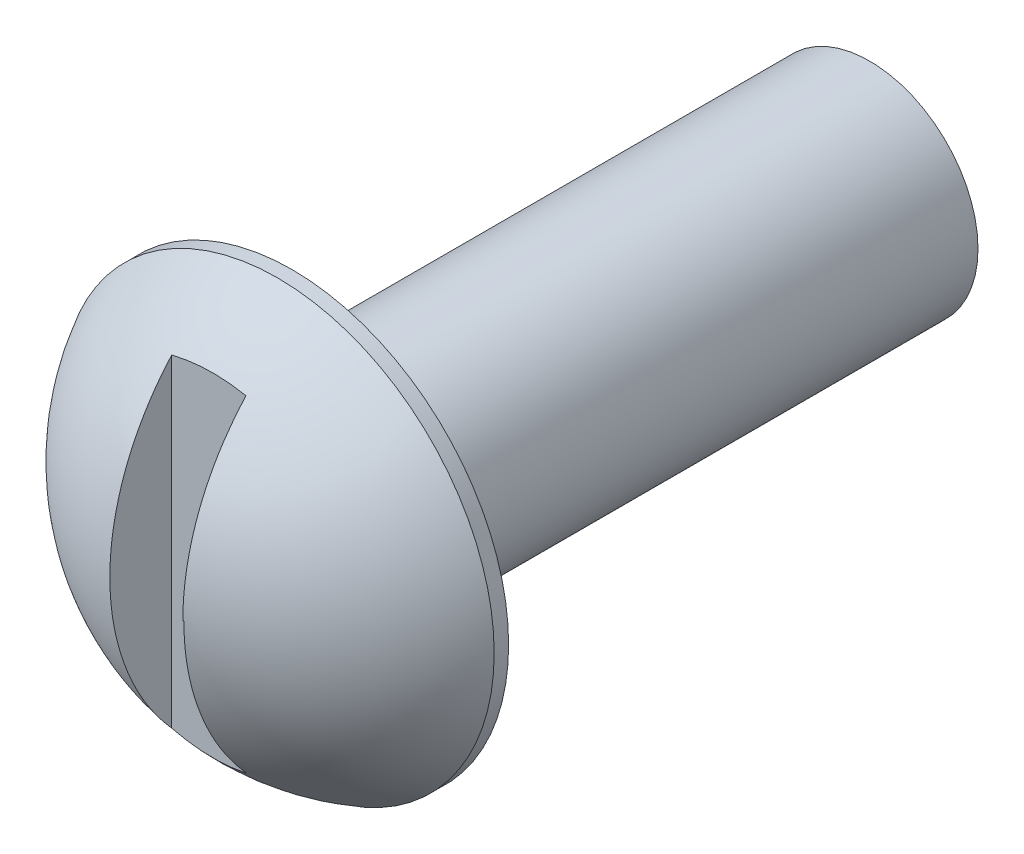
ISO-10303-21;
HEADER;
FILE_DESCRIPTION(('STEP AP214'),'2;1');
FILE_NAME('part.step','',(''),(''),'','','');
FILE_SCHEMA(('AUTOMOTIVE_DESIGN { 1 0 10303 214 1 1 1 1 }'));
ENDSEC;
DATA;
#1=APPLICATION_CONTEXT('core data for automotive mechanical design processes');
#2=APPLICATION_PROTOCOL_DEFINITION('international standard','automotive_design',2000,#1);
#3=PRODUCT_CONTEXT('',#1,'mechanical');
#4=PRODUCT('Part','Part','',(#3));
#5=PRODUCT_RELATED_PRODUCT_CATEGORY('part','',(#4));
#6=PRODUCT_DEFINITION_FORMATION('','',#4);
#7=PRODUCT_DEFINITION_CONTEXT('part definition',#1,'design');
#8=PRODUCT_DEFINITION('design','',#6,#7);
#9=PRODUCT_DEFINITION_SHAPE('','',#8);
#10=(LENGTH_UNIT() NAMED_UNIT(*) SI_UNIT(.MILLI.,.METRE.));
#11=(NAMED_UNIT(*) PLANE_ANGLE_UNIT() SI_UNIT($,.RADIAN.));
#12=(NAMED_UNIT(*) SI_UNIT($,.STERADIAN.) SOLID_ANGLE_UNIT());
#13=UNCERTAINTY_MEASURE_WITH_UNIT(LENGTH_MEASURE(1.E-05),#10,'distance_accuracy_value','');
#14=(GEOMETRIC_REPRESENTATION_CONTEXT(3) GLOBAL_UNCERTAINTY_ASSIGNED_CONTEXT((#13)) GLOBAL_UNIT_ASSIGNED_CONTEXT((#10,
#11,#12)) REPRESENTATION_CONTEXT('',''));
#15=CARTESIAN_POINT('',(0.,0.,0.));
#16=DIRECTION('',(0.,0.,1.));
#17=DIRECTION('',(1.,0.,0.));
#18=AXIS2_PLACEMENT_3D('',#15,#16,#17);
#19=CARTESIAN_POINT('',(0.,0.,8.));
#20=DIRECTION('',(0.,0.,-1.));
#21=DIRECTION('',(-1.,0.,0.));
#22=AXIS2_PLACEMENT_3D('',#19,#20,#21);
#23=CYLINDRICAL_SURFACE('',#22,1.5);
#24=CARTESIAN_POINT('',(0.,0.,8.));
#25=DIRECTION('',(0.,0.,1.));
#26=DIRECTION('',(1.,0.,0.));
#27=AXIS2_PLACEMENT_3D('',#24,#25,#26);
#28=CIRCLE('',#27,1.5);
#29=CARTESIAN_POINT('',(1.5,0.,8.));
#30=VERTEX_POINT('',#29);
#31=EDGE_CURVE('E102',#30,#30,#28,.T.);
#32=ORIENTED_EDGE('',*,*,#31,.F.);
#33=EDGE_LOOP('',(#32));
#34=FACE_BOUND('',#33,.T.);
#35=CARTESIAN_POINT('',(0.,0.,0.));
#36=DIRECTION('',(0.,0.,1.));
#37=DIRECTION('',(1.,0.,0.));
#38=AXIS2_PLACEMENT_3D('',#35,#36,#37);
#39=CIRCLE('',#38,1.5);
#40=CARTESIAN_POINT('',(1.5,0.,0.));
#41=VERTEX_POINT('',#40);
#42=EDGE_CURVE('E105',#41,#41,#39,.T.);
#43=ORIENTED_EDGE('',*,*,#42,.T.);
#44=EDGE_LOOP('',(#43));
#45=FACE_BOUND('',#44,.T.);
#46=ADVANCED_FACE('F31',(#34,#45),#23,.T.);
#47=CARTESIAN_POINT('',(0.,0.,0.));
#48=DIRECTION('',(0.,0.,1.));
#49=DIRECTION('',(1.,0.,0.));
#50=AXIS2_PLACEMENT_3D('',#47,#48,#49);
#51=PLANE('',#50);
#52=ORIENTED_EDGE('',*,*,#42,.F.);
#53=EDGE_LOOP('',(#52));
#54=FACE_BOUND('',#53,.T.);
#55=ADVANCED_FACE('F130',(#54),#51,.F.);
#56=CARTESIAN_POINT('',(0.,0.,8.));
#57=DIRECTION('',(0.,0.,1.));
#58=DIRECTION('',(1.,0.,0.));
#59=AXIS2_PLACEMENT_3D('',#56,#57,#58);
#60=PLANE('',#59);
#61=CARTESIAN_POINT('',(0.,0.,8.));
#62=DIRECTION('',(0.,0.,1.));
#63=DIRECTION('',(1.,0.,0.));
#64=AXIS2_PLACEMENT_3D('',#61,#62,#63);
#65=CIRCLE('',#64,3.);
#66=CARTESIAN_POINT('',(3.,0.,8.));
#67=VERTEX_POINT('',#66);
#68=EDGE_CURVE('E97',#67,#67,#65,.T.);
#69=ORIENTED_EDGE('',*,*,#68,.F.);
#70=EDGE_LOOP('',(#69));
#71=FACE_BOUND('',#70,.T.);
#72=ORIENTED_EDGE('',*,*,#31,.T.);
#73=EDGE_LOOP('',(#72));
#74=FACE_BOUND('',#73,.T.);
#75=ADVANCED_FACE('F135',(#71,#74),#60,.F.);
#76=CARTESIAN_POINT('',(0.,0.,8.2));
#77=DIRECTION('',(0.,0.,-1.));
#78=DIRECTION('',(-1.,0.,0.));
#79=AXIS2_PLACEMENT_3D('',#76,#77,#78);
#80=CYLINDRICAL_SURFACE('',#79,3.);
#81=CARTESIAN_POINT('',(0.,0.,8.2));
#82=DIRECTION('',(0.,0.,1.));
#83=DIRECTION('',(1.,0.,0.));
#84=AXIS2_PLACEMENT_3D('',#81,#82,#83);
#85=CIRCLE('',#84,3.);
#86=CARTESIAN_POINT('',(3.,0.,8.2));
#87=VERTEX_POINT('',#86);
#88=EDGE_CURVE('E101',#87,#87,#85,.T.);
#89=ORIENTED_EDGE('',*,*,#88,.F.);
#90=EDGE_LOOP('',(#89));
#91=FACE_BOUND('',#90,.T.);
#92=ORIENTED_EDGE('',*,*,#68,.T.);
#93=EDGE_LOOP('',(#92));
#94=FACE_BOUND('',#93,.T.);
#95=ADVANCED_FACE('F127',(#91,#94),#80,.T.);
#96=CARTESIAN_POINT('',(0.,0.,6.6));
#97=DIRECTION('',(0.,0.,1.));
#98=DIRECTION('',(1.,0.,0.));
#99=AXIS2_PLACEMENT_3D('',#96,#97,#98);
#100=SPHERICAL_SURFACE('',#99,3.4);
#101=CARTESIAN_POINT('',(-0.56977095979243,0.,6.6));
#102=DIRECTION('',(-1.,0.,0.));
#103=DIRECTION('',(0.,0.,1.));
#104=AXIS2_PLACEMENT_3D('',#101,#102,#103);
#105=CIRCLE('',#104,3.35191901056353);
#106=CARTESIAN_POINT('',(-0.56977095979243,2.23724138297538,9.09601924024628));
#107=VERTEX_POINT('',#106);
#108=CARTESIAN_POINT('',(-0.56977095979243,-2.23724138297538,9.09601924024628));
#109=VERTEX_POINT('',#108);
#110=EDGE_CURVE('E11',#107,#109,#105,.F.);
#111=ORIENTED_EDGE('',*,*,#110,.F.);
#112=CARTESIAN_POINT('',(0.,0.,9.09601924024628));
#113=DIRECTION('',(0.,0.,-1.));
#114=DIRECTION('',(-1.,0.,0.));
#115=AXIS2_PLACEMENT_3D('',#112,#113,#114);
#116=CIRCLE('',#115,2.30865500937676);
#117=CARTESIAN_POINT('',(0.457607569448517,2.26284848469884,9.09601924024628));
#118=VERTEX_POINT('',#117);
#119=EDGE_CURVE('E81',#118,#107,#116,.F.);
#120=ORIENTED_EDGE('',*,*,#119,.F.);
#121=CARTESIAN_POINT('',(0.457607569448517,0.,6.6));
#122=DIRECTION('',(1.,0.,0.));
#123=DIRECTION('',(0.,0.,-1.));
#124=AXIS2_PLACEMENT_3D('',#121,#122,#123);
#125=CIRCLE('',#124,3.36906445654924);
#126=CARTESIAN_POINT('',(0.457607569448517,0.,9.96906445654924));
#127=VERTEX_POINT('',#126);
#128=EDGE_CURVE('E76',#127,#118,#125,.F.);
#129=ORIENTED_EDGE('',*,*,#128,.F.);
#130=CARTESIAN_POINT('',(0.,0.,6.6));
#131=DIRECTION('',(0.,1.,0.));
#132=DIRECTION('',(0.,0.,1.));
#133=AXIS2_PLACEMENT_3D('',#130,#131,#132);
#134=CIRCLE('',#133,3.4);
#135=CARTESIAN_POINT('',(0.470680358089396,0.,9.96726298356823));
#136=VERTEX_POINT('',#135);
#137=EDGE_CURVE('E86',#136,#127,#134,.F.);
#138=ORIENTED_EDGE('',*,*,#137,.F.);
#139=CARTESIAN_POINT('',(0.470680358089396,0.,6.6));
#140=DIRECTION('',(1.,0.,0.));
#141=DIRECTION('',(0.,0.,-1.));
#142=AXIS2_PLACEMENT_3D('',#139,#140,#141);
#143=CIRCLE('',#142,3.36726298356823);
#144=CARTESIAN_POINT('',(0.470680358089396,-2.26016547023204,9.09601924024628));
#145=VERTEX_POINT('',#144);
#146=EDGE_CURVE('E111',#145,#136,#143,.F.);
#147=ORIENTED_EDGE('',*,*,#146,.F.);
#148=CARTESIAN_POINT('',(0.,0.,9.09601924024628));
#149=DIRECTION('',(0.,0.,-1.));
#150=DIRECTION('',(-1.,0.,0.));
#151=AXIS2_PLACEMENT_3D('',#148,#149,#150);
#152=CIRCLE('',#151,2.30865500937676);
#153=EDGE_CURVE('E39',#109,#145,#152,.F.);
#154=ORIENTED_EDGE('',*,*,#153,.F.);
#155=EDGE_LOOP('',(#111,#120,#129,#138,#147,#154));
#156=FACE_BOUND('',#155,.T.);
#157=ORIENTED_EDGE('',*,*,#88,.T.);
#158=EDGE_LOOP('',(#157));
#159=FACE_BOUND('',#158,.T.);
#160=ADVANCED_FACE('F33',(#156,#159),#100,.T.);
#161=CARTESIAN_POINT('',(-0.56977095979243,-50.,11.399885779789));
#162=DIRECTION('',(-1.,0.,0.));
#163=DIRECTION('',(0.,0.,1.));
#164=AXIS2_PLACEMENT_3D('',#161,#162,#163);
#165=PLANE('',#164);
#166=ORIENTED_EDGE('',*,*,#110,.T.);
#167=DIRECTION('',(0.,1.,0.));
#168=VECTOR('',#167,1.);
#169=CARTESIAN_POINT('',(-0.56977095979243,-50.,9.09601924024628));
#170=LINE('',#169,#168);
#171=EDGE_CURVE('E92',#109,#107,#170,.T.);
#172=ORIENTED_EDGE('',*,*,#171,.T.);
#173=EDGE_LOOP('',(#166,#172));
#174=FACE_BOUND('',#173,.T.);
#175=ADVANCED_FACE('F119',(#174),#165,.F.);
#176=CARTESIAN_POINT('',(-0.56977095979243,-50.,9.09601924024628));
#177=DIRECTION('',(0.,0.,-1.));
#178=DIRECTION('',(-1.,0.,0.));
#179=AXIS2_PLACEMENT_3D('',#176,#177,#178);
#180=PLANE('',#179);
#181=ORIENTED_EDGE('',*,*,#153,.T.);
#182=DIRECTION('',(0.,1.,0.));
#183=VECTOR('',#182,1.);
#184=CARTESIAN_POINT('',(0.470680358089396,-50.,9.09601924024628));
#185=LINE('',#184,#183);
#186=CARTESIAN_POINT('',(0.470680358089396,0.,9.09601924024628));
#187=VERTEX_POINT('',#186);
#188=EDGE_CURVE('E90',#145,#187,#185,.T.);
#189=ORIENTED_EDGE('',*,*,#188,.T.);
#190=DIRECTION('',(-1.,0.,0.));
#191=VECTOR('',#190,1.);
#192=CARTESIAN_POINT('',(-0.56977095979243,0.,9.09601924024628));
#193=LINE('',#192,#191);
#194=CARTESIAN_POINT('',(0.457607569448517,0.,9.09601924024628));
#195=VERTEX_POINT('',#194);
#196=EDGE_CURVE('E84',#187,#195,#193,.T.);
#197=ORIENTED_EDGE('',*,*,#196,.T.);
#198=DIRECTION('',(0.,-1.,0.));
#199=VECTOR('',#198,1.);
#200=CARTESIAN_POINT('',(0.457607569448517,50.,9.09601924024628));
#201=LINE('',#200,#199);
#202=EDGE_CURVE('E71',#118,#195,#201,.T.);
#203=ORIENTED_EDGE('',*,*,#202,.F.);
#204=ORIENTED_EDGE('',*,*,#119,.T.);
#205=ORIENTED_EDGE('',*,*,#171,.F.);
#206=EDGE_LOOP('',(#181,#189,#197,#203,#204,#205));
#207=FACE_BOUND('',#206,.T.);
#208=ADVANCED_FACE('F88',(#207),#180,.F.);
#209=CARTESIAN_POINT('',(0.470680358089396,-50.,11.399885779789));
#210=DIRECTION('',(1.,0.,0.));
#211=DIRECTION('',(0.,0.,-1.));
#212=AXIS2_PLACEMENT_3D('',#209,#210,#211);
#213=PLANE('',#212);
#214=ORIENTED_EDGE('',*,*,#146,.T.);
#215=DIRECTION('',(0.,0.,-1.));
#216=VECTOR('',#215,1.);
#217=CARTESIAN_POINT('',(0.470680358089396,0.,11.399885779789));
#218=LINE('',#217,#216);
#219=EDGE_CURVE('E46',#136,#187,#218,.T.);
#220=ORIENTED_EDGE('',*,*,#219,.T.);
#221=ORIENTED_EDGE('',*,*,#188,.F.);
#222=EDGE_LOOP('',(#214,#220,#221));
#223=FACE_BOUND('',#222,.T.);
#224=ADVANCED_FACE('F116',(#223),#213,.F.);
#225=CARTESIAN_POINT('',(0.470680358089396,0.,11.399885779789));
#226=DIRECTION('',(0.,1.,0.));
#227=DIRECTION('',(0.,0.,1.));
#228=AXIS2_PLACEMENT_3D('',#225,#226,#227);
#229=PLANE('',#228);
#230=ORIENTED_EDGE('',*,*,#137,.T.);
#231=DIRECTION('',(0.,0.,1.));
#232=VECTOR('',#231,1.);
#233=CARTESIAN_POINT('',(0.457607569448517,0.,9.09601924024628));
#234=LINE('',#233,#232);
#235=EDGE_CURVE('E74',#195,#127,#234,.T.);
#236=ORIENTED_EDGE('',*,*,#235,.F.);
#237=ORIENTED_EDGE('',*,*,#196,.F.);
#238=ORIENTED_EDGE('',*,*,#219,.F.);
#239=EDGE_LOOP('',(#230,#236,#237,#238));
#240=FACE_BOUND('',#239,.T.);
#241=ADVANCED_FACE('F83',(#240),#229,.F.);
#242=CARTESIAN_POINT('',(0.457607569448517,50.,9.09601924024628));
#243=DIRECTION('',(1.,0.,0.));
#244=DIRECTION('',(0.,0.,-1.));
#245=AXIS2_PLACEMENT_3D('',#242,#243,#244);
#246=PLANE('',#245);
#247=ORIENTED_EDGE('',*,*,#128,.T.);
#248=ORIENTED_EDGE('',*,*,#202,.T.);
#249=ORIENTED_EDGE('',*,*,#235,.T.);
#250=EDGE_LOOP('',(#247,#248,#249));
#251=FACE_BOUND('',#250,.T.);
#252=ADVANCED_FACE('F73',(#251),#246,.F.);
#253=CLOSED_SHELL('',(#46,#55,#75,#95,#160,#175,#208,#224,#241,#252));
#254=MANIFOLD_SOLID_BREP('B2',#253);
#255=ADVANCED_BREP_SHAPE_REPRESENTATION('',(#18,#254),#14);
#256=SHAPE_DEFINITION_REPRESENTATION(#9,#255);
ENDSEC;
END-ISO-10303-21;
